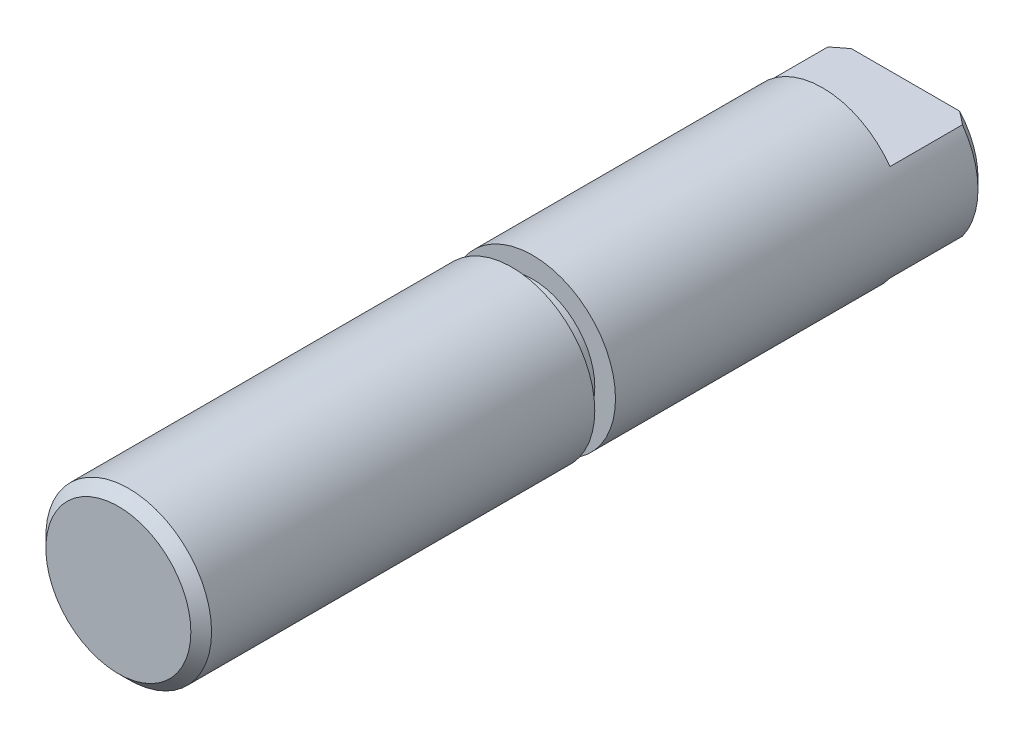
ISO-10303-21;
HEADER;
FILE_DESCRIPTION(('STEP AP214'),'2;1');
FILE_NAME('part.step','',(''),(''),'','','');
FILE_SCHEMA(('AUTOMOTIVE_DESIGN { 1 0 10303 214 1 1 1 1 }'));
ENDSEC;
DATA;
#1=APPLICATION_CONTEXT('core data for automotive mechanical design processes');
#2=APPLICATION_PROTOCOL_DEFINITION('international standard','automotive_design',2000,#1);
#3=PRODUCT_CONTEXT('',#1,'mechanical');
#4=PRODUCT('Part','Part','',(#3));
#5=PRODUCT_RELATED_PRODUCT_CATEGORY('part','',(#4));
#6=PRODUCT_DEFINITION_FORMATION('','',#4);
#7=PRODUCT_DEFINITION_CONTEXT('part definition',#1,'design');
#8=PRODUCT_DEFINITION('design','',#6,#7);
#9=PRODUCT_DEFINITION_SHAPE('','',#8);
#10=(LENGTH_UNIT() NAMED_UNIT(*) SI_UNIT(.MILLI.,.METRE.));
#11=(NAMED_UNIT(*) PLANE_ANGLE_UNIT() SI_UNIT($,.RADIAN.));
#12=(NAMED_UNIT(*) SI_UNIT($,.STERADIAN.) SOLID_ANGLE_UNIT());
#13=UNCERTAINTY_MEASURE_WITH_UNIT(LENGTH_MEASURE(1.E-05),#10,'distance_accuracy_value','');
#14=(GEOMETRIC_REPRESENTATION_CONTEXT(3) GLOBAL_UNCERTAINTY_ASSIGNED_CONTEXT((#13)) GLOBAL_UNIT_ASSIGNED_CONTEXT((#10,
#11,#12)) REPRESENTATION_CONTEXT('',''));
#15=CARTESIAN_POINT('',(0.,0.,0.));
#16=DIRECTION('',(0.,0.,1.));
#17=DIRECTION('',(1.,0.,0.));
#18=AXIS2_PLACEMENT_3D('',#15,#16,#17);
#19=CARTESIAN_POINT('',(0.,0.,38.));
#20=DIRECTION('',(0.,0.,-1.));
#21=DIRECTION('',(-1.,0.,0.));
#22=AXIS2_PLACEMENT_3D('',#19,#20,#21);
#23=CYLINDRICAL_SURFACE('',#22,4.);
#24=DIRECTION('',(0.,0.,-1.));
#25=VECTOR('',#24,1.);
#26=CARTESIAN_POINT('',(-3.2509517795552,-2.33051765215518,4.));
#27=LINE('',#26,#25);
#28=CARTESIAN_POINT('',(-3.2509517795552,-2.33051765215518,4.));
#29=VERTEX_POINT('',#28);
#30=CARTESIAN_POINT('',(-3.2509517795552,-2.33051765215518,0.500000000000001));
#31=VERTEX_POINT('',#30);
#32=EDGE_CURVE('E95',#29,#31,#27,.T.);
#33=ORIENTED_EDGE('',*,*,#32,.F.);
#34=CARTESIAN_POINT('',(0.,0.,4.));
#35=DIRECTION('',(0.,0.,-1.));
#36=DIRECTION('',(-1.,0.,0.));
#37=AXIS2_PLACEMENT_3D('',#34,#35,#36);
#38=CIRCLE('',#37,4.);
#39=CARTESIAN_POINT('',(3.2509517795552,-2.33051765215518,4.));
#40=VERTEX_POINT('',#39);
#41=EDGE_CURVE('E37',#40,#29,#38,.T.);
#42=ORIENTED_EDGE('',*,*,#41,.F.);
#43=DIRECTION('',(0.,0.,-1.));
#44=VECTOR('',#43,1.);
#45=CARTESIAN_POINT('',(3.2509517795552,-2.33051765215518,4.));
#46=LINE('',#45,#44);
#47=CARTESIAN_POINT('',(3.2509517795552,-2.33051765215518,0.5));
#48=VERTEX_POINT('',#47);
#49=EDGE_CURVE('E85',#40,#48,#46,.T.);
#50=ORIENTED_EDGE('',*,*,#49,.T.);
#51=CARTESIAN_POINT('',(0.,0.,0.5));
#52=DIRECTION('',(0.,0.,1.));
#53=DIRECTION('',(1.,0.,0.));
#54=AXIS2_PLACEMENT_3D('',#51,#52,#53);
#55=CIRCLE('',#54,4.);
#56=CARTESIAN_POINT('',(3.2509517795552,2.33051765215518,0.5));
#57=VERTEX_POINT('',#56);
#58=EDGE_CURVE('E167',#48,#57,#55,.T.);
#59=ORIENTED_EDGE('',*,*,#58,.T.);
#60=DIRECTION('',(0.,0.,-1.));
#61=VECTOR('',#60,1.);
#62=CARTESIAN_POINT('',(3.2509517795552,2.33051765215518,4.));
#63=LINE('',#62,#61);
#64=CARTESIAN_POINT('',(3.2509517795552,2.33051765215518,4.));
#65=VERTEX_POINT('',#64);
#66=EDGE_CURVE('E48',#65,#57,#63,.T.);
#67=ORIENTED_EDGE('',*,*,#66,.F.);
#68=CARTESIAN_POINT('',(-3.2509517795552,2.33051765215518,4.));
#69=VERTEX_POINT('',#68);
#70=EDGE_CURVE('E11',#69,#65,#38,.T.);
#71=ORIENTED_EDGE('',*,*,#70,.F.);
#72=DIRECTION('',(0.,0.,-1.));
#73=VECTOR('',#72,1.);
#74=CARTESIAN_POINT('',(-3.2509517795552,2.33051765215518,4.));
#75=LINE('',#74,#73);
#76=CARTESIAN_POINT('',(-3.2509517795552,2.33051765215518,0.5));
#77=VERTEX_POINT('',#76);
#78=EDGE_CURVE('E179',#69,#77,#75,.T.);
#79=ORIENTED_EDGE('',*,*,#78,.T.);
#80=EDGE_CURVE('E171',#77,#31,#55,.T.);
#81=ORIENTED_EDGE('',*,*,#80,.T.);
#82=EDGE_LOOP('',(#33,#42,#50,#59,#67,#71,#79,#81));
#83=FACE_BOUND('',#82,.T.);
#84=CARTESIAN_POINT('',(0.,0.,18.));
#85=DIRECTION('',(0.,0.,1.));
#86=DIRECTION('',(1.,0.,0.));
#87=AXIS2_PLACEMENT_3D('',#84,#85,#86);
#88=CIRCLE('',#87,4.);
#89=CARTESIAN_POINT('',(4.,0.,18.));
#90=VERTEX_POINT('',#89);
#91=EDGE_CURVE('E160',#90,#90,#88,.T.);
#92=ORIENTED_EDGE('',*,*,#91,.F.);
#93=EDGE_LOOP('',(#92));
#94=FACE_BOUND('',#93,.T.);
#95=ADVANCED_FACE('F33',(#83,#94),#23,.T.);
#96=CARTESIAN_POINT('',(0.,0.,0.));
#97=DIRECTION('',(0.,0.,1.));
#98=DIRECTION('',(1.,0.,0.));
#99=AXIS2_PLACEMENT_3D('',#96,#97,#98);
#100=PLANE('',#99);
#101=DIRECTION('',(1.,0.,0.));
#102=VECTOR('',#101,1.);
#103=CARTESIAN_POINT('',(3.2509517795552,2.33051765215518,0.));
#104=LINE('',#103,#102);
#105=CARTESIAN_POINT('',(-2.61126166306502,2.33051765215518,0.));
#106=VERTEX_POINT('',#105);
#107=CARTESIAN_POINT('',(2.61126166306502,2.33051765215518,0.));
#108=VERTEX_POINT('',#107);
#109=EDGE_CURVE('E100',#106,#108,#104,.T.);
#110=ORIENTED_EDGE('',*,*,#109,.T.);
#111=CARTESIAN_POINT('',(0.,0.,0.));
#112=DIRECTION('',(0.,0.,1.));
#113=DIRECTION('',(1.,0.,0.));
#114=AXIS2_PLACEMENT_3D('',#111,#112,#113);
#115=CIRCLE('',#114,3.5);
#116=CARTESIAN_POINT('',(2.61126166306502,-2.33051765215518,0.));
#117=VERTEX_POINT('',#116);
#118=EDGE_CURVE('E150',#108,#117,#115,.F.);
#119=ORIENTED_EDGE('',*,*,#118,.T.);
#120=DIRECTION('',(-1.,0.,0.));
#121=VECTOR('',#120,1.);
#122=CARTESIAN_POINT('',(3.2509517795552,-2.33051765215518,0.));
#123=LINE('',#122,#121);
#124=CARTESIAN_POINT('',(-2.61126166306502,-2.33051765215518,0.));
#125=VERTEX_POINT('',#124);
#126=EDGE_CURVE('E56',#117,#125,#123,.T.);
#127=ORIENTED_EDGE('',*,*,#126,.T.);
#128=EDGE_CURVE('E146',#125,#106,#115,.F.);
#129=ORIENTED_EDGE('',*,*,#128,.T.);
#130=EDGE_LOOP('',(#110,#119,#127,#129));
#131=FACE_BOUND('',#130,.T.);
#132=ADVANCED_FACE('F185',(#131),#100,.F.);
#133=CARTESIAN_POINT('',(0.,0.,0.5));
#134=DIRECTION('',(0.,0.,1.));
#135=DIRECTION('',(1.,0.,0.));
#136=AXIS2_PLACEMENT_3D('',#133,#134,#135);
#137=CONICAL_SURFACE('',#136,4.,0.785398163397448);
#138=ORIENTED_EDGE('',*,*,#80,.F.);
#139=CARTESIAN_POINT('',(-5.73388572540369,2.33051765215518,2.68940692142592));
#140=CARTESIAN_POINT('',(-5.60731575608518,2.33051765215518,2.5721641204316));
#141=CARTESIAN_POINT('',(-5.48048197618791,2.33051765215518,2.45520432963373));
#142=CARTESIAN_POINT('',(-5.22614715379562,2.33051765215518,2.22200241810012));
#143=CARTESIAN_POINT('',(-5.09864608445902,2.33051765215518,2.10576032665007));
#144=CARTESIAN_POINT('',(-4.84278100536602,2.33051765215518,1.87409498648595));
#145=CARTESIAN_POINT('',(-4.71441658267713,2.33051765215518,1.75867219330412));
#146=CARTESIAN_POINT('',(-4.45670676711698,2.33051765215518,1.52892974323721));
#147=CARTESIAN_POINT('',(-4.32736138994055,2.33051765215518,1.41461006876893));
#148=CARTESIAN_POINT('',(-4.06908239557455,2.33051765215518,1.18880170961217));
#149=CARTESIAN_POINT('',(-3.94016412186121,2.33051765215518,1.07729550378773));
#150=CARTESIAN_POINT('',(-3.68082104129383,2.33051765215518,0.856050172075116));
#151=CARTESIAN_POINT('',(-3.55039626586791,2.33051765215518,0.746311009437434));
#152=CARTESIAN_POINT('',(-3.28756429549768,2.33051765215518,0.529131863357675));
#153=CARTESIAN_POINT('',(-3.15515642813674,2.33051765215518,0.421692691222295));
#154=CARTESIAN_POINT('',(-2.88781797990262,2.33051765215518,0.210003699530421));
#155=CARTESIAN_POINT('',(-2.75288760220152,2.33051765215518,0.105753624880377));
#156=CARTESIAN_POINT('',(-2.47821660451877,2.33051765215518,-0.0993494025888269));
#157=CARTESIAN_POINT('',(-2.33844014802251,2.33051765215518,-0.20015460727983));
#158=CARTESIAN_POINT('',(-2.05445172681851,2.33051765215518,-0.394944980556264));
#159=CARTESIAN_POINT('',(-1.91024713988186,2.33051765215518,-0.488940700777523));
#160=CARTESIAN_POINT('',(-1.68874998671997,2.33051765215518,-0.622548838785042));
#161=CARTESIAN_POINT('',(-1.61377629576273,2.33051765215518,-0.665995301328037));
#162=CARTESIAN_POINT('',(-1.46203523167284,2.33051765215518,-0.749573961171616));
#163=CARTESIAN_POINT('',(-1.38526864977759,2.33051765215518,-0.789707586313498));
#164=CARTESIAN_POINT('',(-1.22929017984206,2.33051765215518,-0.866027468600411));
#165=CARTESIAN_POINT('',(-1.15006796093101,2.33051765215518,-0.902192924590309));
#166=CARTESIAN_POINT('',(-0.98929201076314,2.33051765215518,-0.96924867425899));
#167=CARTESIAN_POINT('',(-0.907734889416634,2.33051765215518,-1.00013079080809));
#168=CARTESIAN_POINT('',(-0.825003733230267,2.33051765215518,-1.02776544663526));
#169=B_SPLINE_CURVE_WITH_KNOTS('',3,(#139,#140,#141,#142,#143,#144,#145,#146,#147,#148,#149,
#150,#151,#152,#153,#154,#155,#156,#157,#158,#159,#160,#161,#162,#163,#164,#165,#166,#167,#168),
.UNSPECIFIED.,.F.,.F.,(4,2,2,2,2,2,2,2,2,2,2,2,2,2,4),(0.,0.517584695560516,1.03519037337345,
1.55306427075407,2.0709298997876,2.5822710074898,3.09360146697106,3.60510941795116,
4.11657634623109,4.63346711312542,5.14953899587196,5.40943196198875,5.66921232225813,
5.93029522631801,6.19177862804984),.UNSPECIFIED.);
#170=EDGE_CURVE('E104',#77,#106,#169,.T.);
#171=ORIENTED_EDGE('',*,*,#170,.T.);
#172=ORIENTED_EDGE('',*,*,#128,.F.);
#173=CARTESIAN_POINT('',(-0.825003733230266,-2.33051765215518,-1.02776544663526));
#174=CARTESIAN_POINT('',(-0.896718553872135,-2.33051765215518,-1.00381999565089));
#175=CARTESIAN_POINT('',(-0.967560562379117,-2.33051765215518,-0.977419023269358));
#176=CARTESIAN_POINT('',(-1.10749215955589,-2.33051765215518,-0.920513362812657));
#177=CARTESIAN_POINT('',(-1.17658362401903,-2.33051765215518,-0.89001330910325));
#178=CARTESIAN_POINT('',(-1.31292697469898,-2.33051765215518,-0.825773119706462));
#179=CARTESIAN_POINT('',(-1.38018448942471,-2.33051765215518,-0.792044790678153));
#180=CARTESIAN_POINT('',(-1.51327401106759,-2.33051765215518,-0.72184983269238));
#181=CARTESIAN_POINT('',(-1.57910556325471,-2.33051765215518,-0.685382346328523));
#182=CARTESIAN_POINT('',(-1.77373084078406,-2.33051765215518,-0.573192721668771));
#183=CARTESIAN_POINT('',(-1.90063792371487,-2.33051765215518,-0.49420251813601));
#184=CARTESIAN_POINT('',(-2.15058217323671,-2.33051765215518,-0.330229943751948));
#185=CARTESIAN_POINT('',(-2.27361654828054,-2.33051765215518,-0.245243387421074));
#186=CARTESIAN_POINT('',(-2.43224329289965,-2.33051765215518,-0.131549698599498));
#187=CARTESIAN_POINT('',(-2.4692175660887,-2.33051765215518,-0.104750586232762));
#188=CARTESIAN_POINT('',(-2.54292699801604,-2.33051765215518,-0.050774035250681));
#189=CARTESIAN_POINT('',(-2.57966198192801,-2.33051765215518,-0.0235963575366828));
#190=CARTESIAN_POINT('',(-2.75433864437303,-2.33051765215518,0.106831516344659));
#191=CARTESIAN_POINT('',(-2.8906872984221,-2.33051765215518,0.212218770225));
#192=CARTESIAN_POINT('',(-3.16082093088856,-2.33051765215518,0.426236699227543));
#193=CARTESIAN_POINT('',(-3.2946055826097,-2.33051765215518,0.534867783215369));
#194=CARTESIAN_POINT('',(-3.56027887060327,-2.33051765215518,0.754564705095687));
#195=CARTESIAN_POINT('',(-3.69216643657925,-2.33051765215518,0.865631834520771));
#196=CARTESIAN_POINT('',(-3.95441257483383,-2.33051765215518,1.08955776063682));
#197=CARTESIAN_POINT('',(-4.08477111216168,-2.33051765215518,1.20241659814467));
#198=CARTESIAN_POINT('',(-4.34306130393629,-2.33051765215518,1.42845090869684));
#199=CARTESIAN_POINT('',(-4.47100425312682,-2.33051765215518,1.54161349547144));
#200=CARTESIAN_POINT('',(-4.72593687743423,-2.33051765215518,1.76901094084221));
#201=CARTESIAN_POINT('',(-4.85292653437253,-2.33051765215518,1.8832458197932));
#202=CARTESIAN_POINT('',(-5.10594532837349,-2.33051765215518,2.11240690759657));
#203=CARTESIAN_POINT('',(-5.23197558947611,-2.33051765215518,2.22733187680552));
#204=CARTESIAN_POINT('',(-5.48338515064559,-2.33051765215518,2.45788125319781));
#205=CARTESIAN_POINT('',(-5.60876447807697,-2.33051765215518,2.57350563052904));
#206=CARTESIAN_POINT('',(-5.73388572540369,-2.33051765215518,2.68940692142592));
#207=B_SPLINE_CURVE_WITH_KNOTS('',3,(#173,#174,#175,#176,#177,#178,#179,#180,#181,#182,#183,
#184,#185,#186,#187,#188,#189,#190,#191,#192,#193,#194,#195,#196,#197,#198,#199,#200,#201,#202,
#203,#204,#205,#206),.UNSPECIFIED.,.F.,.F.,(4,2,2,2,2,2,2,2,2,2,2,2,2,2,2,2,4),(0.,
0.22670330362732,0.45315242253612,0.678802889643996,0.904524286214513,1.35269271931142,
1.80117713109908,1.93817101829719,2.07525575178914,2.59216126209664,3.10913220261374,
3.62638419106375,4.14364797998117,4.65606272327906,5.16848721324991,5.68017017331485,
6.19183144572567),.UNSPECIFIED.);
#208=EDGE_CURVE('E111',#125,#31,#207,.T.);
#209=ORIENTED_EDGE('',*,*,#208,.T.);
#210=EDGE_LOOP('',(#138,#171,#172,#209));
#211=FACE_BOUND('',#210,.T.);
#212=ADVANCED_FACE('F122',(#211),#137,.T.);
#213=ORIENTED_EDGE('',*,*,#118,.F.);
#214=CARTESIAN_POINT('',(0.825003733230267,2.33051765215518,-1.02776544663526));
#215=CARTESIAN_POINT('',(0.896718553872136,2.33051765215518,-1.00381999565089));
#216=CARTESIAN_POINT('',(0.967560562379118,2.33051765215518,-0.977419023269358));
#217=CARTESIAN_POINT('',(1.10749215955589,2.33051765215518,-0.920513362812657));
#218=CARTESIAN_POINT('',(1.17658362401903,2.33051765215518,-0.89001330910325));
#219=CARTESIAN_POINT('',(1.31292697469899,2.33051765215518,-0.825773119706461));
#220=CARTESIAN_POINT('',(1.38018448942471,2.33051765215518,-0.792044790678152));
#221=CARTESIAN_POINT('',(1.51327401106759,2.33051765215518,-0.721849832692378));
#222=CARTESIAN_POINT('',(1.57910556325471,2.33051765215518,-0.685382346328521));
#223=CARTESIAN_POINT('',(1.77373084078406,2.33051765215518,-0.573192721668768));
#224=CARTESIAN_POINT('',(1.90063792371487,2.33051765215518,-0.494202518136008));
#225=CARTESIAN_POINT('',(2.15058217323672,2.33051765215518,-0.330229943751946));
#226=CARTESIAN_POINT('',(2.27361654828054,2.33051765215518,-0.245243387421071));
#227=CARTESIAN_POINT('',(2.43224329289965,2.33051765215518,-0.131549698599496));
#228=CARTESIAN_POINT('',(2.4692175660887,2.33051765215518,-0.104750586232761));
#229=CARTESIAN_POINT('',(2.54292699801604,2.33051765215518,-0.0507740352506806));
#230=CARTESIAN_POINT('',(2.57966198192801,2.33051765215518,-0.0235963575366825));
#231=CARTESIAN_POINT('',(2.75433864437303,2.33051765215518,0.10683151634466));
#232=CARTESIAN_POINT('',(2.8906872984221,2.33051765215518,0.212218770225001));
#233=CARTESIAN_POINT('',(3.16082093088857,2.33051765215518,0.426236699227545));
#234=CARTESIAN_POINT('',(3.2946055826097,2.33051765215518,0.534867783215371));
#235=CARTESIAN_POINT('',(3.56027887060327,2.33051765215518,0.75456470509569));
#236=CARTESIAN_POINT('',(3.69216643657926,2.33051765215518,0.865631834520775));
#237=CARTESIAN_POINT('',(3.95441257483384,2.33051765215518,1.08955776063683));
#238=CARTESIAN_POINT('',(4.08477111216169,2.33051765215518,1.20241659814467));
#239=CARTESIAN_POINT('',(4.34306130393629,2.33051765215518,1.42845090869685));
#240=CARTESIAN_POINT('',(4.47100425312683,2.33051765215518,1.54161349547144));
#241=CARTESIAN_POINT('',(4.72593687743424,2.33051765215518,1.76901094084222));
#242=CARTESIAN_POINT('',(4.85292653437254,2.33051765215518,1.8832458197932));
#243=CARTESIAN_POINT('',(5.10594532837349,2.33051765215518,2.11240690759657));
#244=CARTESIAN_POINT('',(5.23197558947612,2.33051765215518,2.22733187680552));
#245=CARTESIAN_POINT('',(5.48338515064559,2.33051765215518,2.45788125319781));
#246=CARTESIAN_POINT('',(5.60876447807697,2.33051765215518,2.57350563052905));
#247=CARTESIAN_POINT('',(5.73388572540369,2.33051765215518,2.68940692142592));
#248=B_SPLINE_CURVE_WITH_KNOTS('',3,(#214,#215,#216,#217,#218,#219,#220,#221,#222,#223,#224,
#225,#226,#227,#228,#229,#230,#231,#232,#233,#234,#235,#236,#237,#238,#239,#240,#241,#242,#243,
#244,#245,#246,#247),.UNSPECIFIED.,.F.,.F.,(4,2,2,2,2,2,2,2,2,2,2,2,2,2,2,2,4),(0.,
0.226703303627321,0.453152422536122,0.678802889643999,0.904524286214517,1.35269271931142,
1.80117713109908,1.93817101829719,2.07525575178914,2.59216126209664,3.10913220261374,
3.62638419106376,4.14364797998118,4.65606272327907,5.16848721324991,5.68017017331486,
6.19183144572567),.UNSPECIFIED.);
#249=EDGE_CURVE('E106',#108,#57,#248,.T.);
#250=ORIENTED_EDGE('',*,*,#249,.T.);
#251=ORIENTED_EDGE('',*,*,#58,.F.);
#252=CARTESIAN_POINT('',(5.73388572540369,-2.33051765215518,2.68940692142592));
#253=CARTESIAN_POINT('',(5.60731575608518,-2.33051765215518,2.5721641204316));
#254=CARTESIAN_POINT('',(5.48048197618791,-2.33051765215518,2.45520432963373));
#255=CARTESIAN_POINT('',(5.22614715379562,-2.33051765215518,2.22200241810012));
#256=CARTESIAN_POINT('',(5.09864608445902,-2.33051765215518,2.10576032665007));
#257=CARTESIAN_POINT('',(4.84278100536602,-2.33051765215518,1.87409498648595));
#258=CARTESIAN_POINT('',(4.71441658267713,-2.33051765215518,1.75867219330412));
#259=CARTESIAN_POINT('',(4.45670676711698,-2.33051765215518,1.52892974323721));
#260=CARTESIAN_POINT('',(4.32736138994055,-2.33051765215518,1.41461006876893));
#261=CARTESIAN_POINT('',(4.06908239557455,-2.33051765215518,1.18880170961217));
#262=CARTESIAN_POINT('',(3.94016412186121,-2.33051765215518,1.07729550378773));
#263=CARTESIAN_POINT('',(3.68082104129383,-2.33051765215518,0.856050172075116));
#264=CARTESIAN_POINT('',(3.55039626586791,-2.33051765215518,0.746311009437434));
#265=CARTESIAN_POINT('',(3.28756429549768,-2.33051765215518,0.529131863357675));
#266=CARTESIAN_POINT('',(3.15515642813674,-2.33051765215518,0.421692691222295));
#267=CARTESIAN_POINT('',(2.88781797990262,-2.33051765215518,0.210003699530421));
#268=CARTESIAN_POINT('',(2.75288760220152,-2.33051765215518,0.105753624880376));
#269=CARTESIAN_POINT('',(2.47821660451877,-2.33051765215518,-0.0993494025888279));
#270=CARTESIAN_POINT('',(2.33844014802251,-2.33051765215518,-0.200154607279831));
#271=CARTESIAN_POINT('',(2.05445172681851,-2.33051765215518,-0.394944980556265));
#272=CARTESIAN_POINT('',(1.91024713988185,-2.33051765215518,-0.488940700777524));
#273=CARTESIAN_POINT('',(1.68874998671997,-2.33051765215518,-0.622548838785043));
#274=CARTESIAN_POINT('',(1.61377629576273,-2.33051765215518,-0.665995301328037));
#275=CARTESIAN_POINT('',(1.46203523167284,-2.33051765215518,-0.749573961171616));
#276=CARTESIAN_POINT('',(1.38526864977759,-2.33051765215518,-0.789707586313498));
#277=CARTESIAN_POINT('',(1.22929017984206,-2.33051765215518,-0.866027468600411));
#278=CARTESIAN_POINT('',(1.15006796093101,-2.33051765215518,-0.902192924590309));
#279=CARTESIAN_POINT('',(0.98929201076314,-2.33051765215518,-0.96924867425899));
#280=CARTESIAN_POINT('',(0.907734889416633,-2.33051765215518,-1.00013079080809));
#281=CARTESIAN_POINT('',(0.825003733230266,-2.33051765215518,-1.02776544663526));
#282=B_SPLINE_CURVE_WITH_KNOTS('',3,(#252,#253,#254,#255,#256,#257,#258,#259,#260,#261,#262,
#263,#264,#265,#266,#267,#268,#269,#270,#271,#272,#273,#274,#275,#276,#277,#278,#279,#280,#281),
.UNSPECIFIED.,.F.,.F.,(4,2,2,2,2,2,2,2,2,2,2,2,2,2,4),(0.,0.517584695560516,1.03519037337345,
1.55306427075407,2.0709298997876,2.5822710074898,3.09360146697106,3.60510941795116,
4.11657634623109,4.63346711312542,5.14953899587196,5.40943196198876,5.66921232225813,
5.93029522631801,6.19177862804985),.UNSPECIFIED.);
#283=EDGE_CURVE('E90',#48,#117,#282,.T.);
#284=ORIENTED_EDGE('',*,*,#283,.T.);
#285=EDGE_LOOP('',(#213,#250,#251,#284));
#286=FACE_BOUND('',#285,.T.);
#287=ADVANCED_FACE('F187',(#286),#137,.T.);
#288=CARTESIAN_POINT('',(0.,0.,18.));
#289=DIRECTION('',(0.,0.,1.));
#290=DIRECTION('',(1.,0.,0.));
#291=AXIS2_PLACEMENT_3D('',#288,#289,#290);
#292=PLANE('',#291);
#293=CARTESIAN_POINT('',(0.,0.,18.));
#294=DIRECTION('',(0.,0.,1.));
#295=DIRECTION('',(1.,0.,0.));
#296=AXIS2_PLACEMENT_3D('',#293,#294,#295);
#297=CIRCLE('',#296,3.);
#298=CARTESIAN_POINT('',(3.,0.,18.));
#299=VERTEX_POINT('',#298);
#300=EDGE_CURVE('E161',#299,#299,#297,.T.);
#301=ORIENTED_EDGE('',*,*,#300,.F.);
#302=EDGE_LOOP('',(#301));
#303=FACE_BOUND('',#302,.T.);
#304=ORIENTED_EDGE('',*,*,#91,.T.);
#305=EDGE_LOOP('',(#304));
#306=FACE_BOUND('',#305,.T.);
#307=ADVANCED_FACE('F192',(#303,#306),#292,.T.);
#308=CARTESIAN_POINT('',(0.,0.,19.));
#309=DIRECTION('',(0.,0.,1.));
#310=DIRECTION('',(1.,0.,0.));
#311=AXIS2_PLACEMENT_3D('',#308,#309,#310);
#312=PLANE('',#311);
#313=CARTESIAN_POINT('',(0.,0.,19.));
#314=DIRECTION('',(0.,0.,1.));
#315=DIRECTION('',(1.,0.,0.));
#316=AXIS2_PLACEMENT_3D('',#313,#314,#315);
#317=CIRCLE('',#316,3.);
#318=CARTESIAN_POINT('',(3.,0.,19.));
#319=VERTEX_POINT('',#318);
#320=EDGE_CURVE('E175',#319,#319,#317,.T.);
#321=ORIENTED_EDGE('',*,*,#320,.T.);
#322=EDGE_LOOP('',(#321));
#323=FACE_BOUND('',#322,.T.);
#324=CARTESIAN_POINT('',(0.,0.,19.));
#325=DIRECTION('',(0.,0.,1.));
#326=DIRECTION('',(1.,0.,0.));
#327=AXIS2_PLACEMENT_3D('',#324,#325,#326);
#328=CIRCLE('',#327,4.);
#329=CARTESIAN_POINT('',(4.,0.,19.));
#330=VERTEX_POINT('',#329);
#331=EDGE_CURVE('E158',#330,#330,#328,.T.);
#332=ORIENTED_EDGE('',*,*,#331,.F.);
#333=EDGE_LOOP('',(#332));
#334=FACE_BOUND('',#333,.T.);
#335=ADVANCED_FACE('F251',(#323,#334),#312,.F.);
#336=CARTESIAN_POINT('',(0.,0.,18.));
#337=DIRECTION('',(0.,0.,1.));
#338=DIRECTION('',(1.,0.,0.));
#339=AXIS2_PLACEMENT_3D('',#336,#337,#338);
#340=CYLINDRICAL_SURFACE('',#339,3.);
#341=ORIENTED_EDGE('',*,*,#300,.T.);
#342=EDGE_LOOP('',(#341));
#343=FACE_BOUND('',#342,.T.);
#344=ORIENTED_EDGE('',*,*,#320,.F.);
#345=EDGE_LOOP('',(#344));
#346=FACE_BOUND('',#345,.T.);
#347=ADVANCED_FACE('F243',(#343,#346),#340,.T.);
#348=CARTESIAN_POINT('',(0.,0.,38.));
#349=DIRECTION('',(0.,0.,1.));
#350=DIRECTION('',(1.,0.,0.));
#351=AXIS2_PLACEMENT_3D('',#348,#349,#350);
#352=PLANE('',#351);
#353=CARTESIAN_POINT('',(0.,0.,38.));
#354=DIRECTION('',(0.,0.,1.));
#355=DIRECTION('',(1.,0.,0.));
#356=AXIS2_PLACEMENT_3D('',#353,#354,#355);
#357=CIRCLE('',#356,3.5);
#358=CARTESIAN_POINT('',(3.5,0.,38.));
#359=VERTEX_POINT('',#358);
#360=EDGE_CURVE('E163',#359,#359,#357,.T.);
#361=ORIENTED_EDGE('',*,*,#360,.T.);
#362=EDGE_LOOP('',(#361));
#363=FACE_BOUND('',#362,.T.);
#364=ADVANCED_FACE('F203',(#363),#352,.T.);
#365=CARTESIAN_POINT('',(0.,0.,38.));
#366=DIRECTION('',(0.,0.,-1.));
#367=DIRECTION('',(-1.,0.,0.));
#368=AXIS2_PLACEMENT_3D('',#365,#366,#367);
#369=CONICAL_SURFACE('',#368,3.5,0.785398163397447);
#370=CARTESIAN_POINT('',(0.,0.,37.5));
#371=DIRECTION('',(0.,0.,1.));
#372=DIRECTION('',(1.,0.,0.));
#373=AXIS2_PLACEMENT_3D('',#370,#371,#372);
#374=CIRCLE('',#373,4.);
#375=CARTESIAN_POINT('',(4.,0.,37.5));
#376=VERTEX_POINT('',#375);
#377=EDGE_CURVE('E154',#376,#376,#374,.F.);
#378=ORIENTED_EDGE('',*,*,#377,.F.);
#379=EDGE_LOOP('',(#378));
#380=FACE_BOUND('',#379,.T.);
#381=ORIENTED_EDGE('',*,*,#360,.F.);
#382=EDGE_LOOP('',(#381));
#383=FACE_BOUND('',#382,.T.);
#384=ADVANCED_FACE('F198',(#380,#383),#369,.T.);
#385=ORIENTED_EDGE('',*,*,#331,.T.);
#386=EDGE_LOOP('',(#385));
#387=FACE_BOUND('',#386,.T.);
#388=ORIENTED_EDGE('',*,*,#377,.T.);
#389=EDGE_LOOP('',(#388));
#390=FACE_BOUND('',#389,.T.);
#391=ADVANCED_FACE('F35',(#387,#390),#23,.T.);
#392=CARTESIAN_POINT('',(3.2509517795552,-2.33051765215518,4.));
#393=DIRECTION('',(0.,-1.,0.));
#394=DIRECTION('',(0.,0.,-1.));
#395=AXIS2_PLACEMENT_3D('',#392,#393,#394);
#396=PLANE('',#395);
#397=ORIENTED_EDGE('',*,*,#126,.F.);
#398=ORIENTED_EDGE('',*,*,#283,.F.);
#399=ORIENTED_EDGE('',*,*,#49,.F.);
#400=DIRECTION('',(-1.,0.,0.));
#401=VECTOR('',#400,1.);
#402=CARTESIAN_POINT('',(3.2509517795552,-2.33051765215518,4.));
#403=LINE('',#402,#401);
#404=EDGE_CURVE('E88',#40,#29,#403,.T.);
#405=ORIENTED_EDGE('',*,*,#404,.T.);
#406=ORIENTED_EDGE('',*,*,#32,.T.);
#407=ORIENTED_EDGE('',*,*,#208,.F.);
#408=EDGE_LOOP('',(#397,#398,#399,#405,#406,#407));
#409=FACE_BOUND('',#408,.T.);
#410=ADVANCED_FACE('F87',(#409),#396,.T.);
#411=CARTESIAN_POINT('',(0.,0.,4.));
#412=DIRECTION('',(0.,0.,-1.));
#413=DIRECTION('',(-1.,0.,0.));
#414=AXIS2_PLACEMENT_3D('',#411,#412,#413);
#415=PLANE('',#414);
#416=ORIENTED_EDGE('',*,*,#41,.T.);
#417=ORIENTED_EDGE('',*,*,#404,.F.);
#418=EDGE_LOOP('',(#416,#417));
#419=FACE_BOUND('',#418,.T.);
#420=ADVANCED_FACE('F99',(#419),#415,.T.);
#421=ORIENTED_EDGE('',*,*,#70,.T.);
#422=DIRECTION('',(1.,0.,0.));
#423=VECTOR('',#422,1.);
#424=CARTESIAN_POINT('',(3.2509517795552,2.33051765215518,4.));
#425=LINE('',#424,#423);
#426=EDGE_CURVE('E96',#69,#65,#425,.T.);
#427=ORIENTED_EDGE('',*,*,#426,.F.);
#428=EDGE_LOOP('',(#421,#427));
#429=FACE_BOUND('',#428,.T.);
#430=ADVANCED_FACE('F130',(#429),#415,.T.);
#431=CARTESIAN_POINT('',(3.2509517795552,2.33051765215518,4.));
#432=DIRECTION('',(0.,1.,0.));
#433=DIRECTION('',(0.,0.,1.));
#434=AXIS2_PLACEMENT_3D('',#431,#432,#433);
#435=PLANE('',#434);
#436=ORIENTED_EDGE('',*,*,#78,.F.);
#437=ORIENTED_EDGE('',*,*,#426,.T.);
#438=ORIENTED_EDGE('',*,*,#66,.T.);
#439=ORIENTED_EDGE('',*,*,#249,.F.);
#440=ORIENTED_EDGE('',*,*,#109,.F.);
#441=ORIENTED_EDGE('',*,*,#170,.F.);
#442=EDGE_LOOP('',(#436,#437,#438,#439,#440,#441));
#443=FACE_BOUND('',#442,.T.);
#444=ADVANCED_FACE('F126',(#443),#435,.T.);
#445=CLOSED_SHELL('',(#95,#132,#212,#287,#307,#335,#347,#364,#384,#391,#410,#420,#430,#444));
#446=MANIFOLD_SOLID_BREP('B2',#445);
#447=ADVANCED_BREP_SHAPE_REPRESENTATION('',(#18,#446),#14);
#448=SHAPE_DEFINITION_REPRESENTATION(#9,#447);
ENDSEC;
END-ISO-10303-21;
